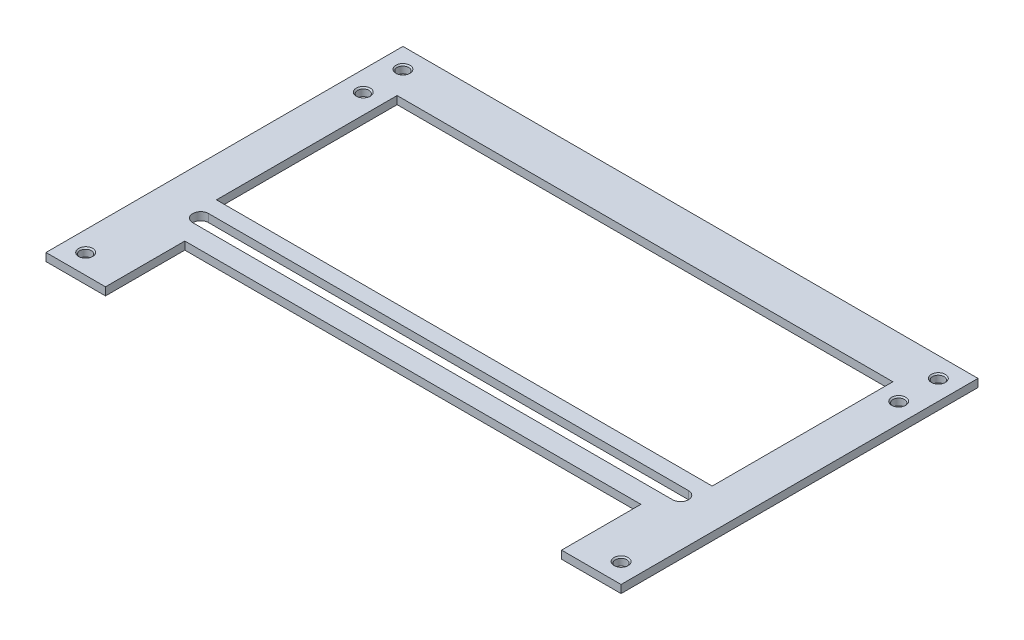
ISO-10303-21;
HEADER;
FILE_DESCRIPTION(('STEP AP214'),'2;1');
FILE_NAME('part.step','',(''),(''),'','','');
FILE_SCHEMA(('AUTOMOTIVE_DESIGN { 1 0 10303 214 1 1 1 1 }'));
ENDSEC;
DATA;
#1=APPLICATION_CONTEXT('core data for automotive mechanical design processes');
#2=APPLICATION_PROTOCOL_DEFINITION('international standard','automotive_design',2000,#1);
#3=PRODUCT_CONTEXT('',#1,'mechanical');
#4=PRODUCT('Part','Part','',(#3));
#5=PRODUCT_RELATED_PRODUCT_CATEGORY('part','',(#4));
#6=PRODUCT_DEFINITION_FORMATION('','',#4);
#7=PRODUCT_DEFINITION_CONTEXT('part definition',#1,'design');
#8=PRODUCT_DEFINITION('design','',#6,#7);
#9=PRODUCT_DEFINITION_SHAPE('','',#8);
#10=(LENGTH_UNIT() NAMED_UNIT(*) SI_UNIT(.MILLI.,.METRE.));
#11=(NAMED_UNIT(*) PLANE_ANGLE_UNIT() SI_UNIT($,.RADIAN.));
#12=(NAMED_UNIT(*) SI_UNIT($,.STERADIAN.) SOLID_ANGLE_UNIT());
#13=UNCERTAINTY_MEASURE_WITH_UNIT(LENGTH_MEASURE(1.E-05),#10,'distance_accuracy_value','');
#14=(GEOMETRIC_REPRESENTATION_CONTEXT(3) GLOBAL_UNCERTAINTY_ASSIGNED_CONTEXT((#13)) GLOBAL_UNIT_ASSIGNED_CONTEXT((#10,
#11,#12)) REPRESENTATION_CONTEXT('',''));
#15=CARTESIAN_POINT('',(0.,0.,0.));
#16=DIRECTION('',(0.,0.,1.));
#17=DIRECTION('',(1.,0.,0.));
#18=AXIS2_PLACEMENT_3D('',#15,#16,#17);
#19=CARTESIAN_POINT('',(0.,2.,0.));
#20=DIRECTION('',(1.,0.,0.));
#21=DIRECTION('',(0.,0.,-1.));
#22=AXIS2_PLACEMENT_3D('',#19,#20,#21);
#23=PLANE('',#22);
#24=DIRECTION('',(0.,0.,1.));
#25=VECTOR('',#24,1.);
#26=CARTESIAN_POINT('',(0.,0.,0.));
#27=LINE('',#26,#25);
#28=CARTESIAN_POINT('',(0.,0.,-80.));
#29=VERTEX_POINT('',#28);
#30=CARTESIAN_POINT('',(0.,0.,10.));
#31=VERTEX_POINT('',#30);
#32=EDGE_CURVE('E254',#29,#31,#27,.T.);
#33=ORIENTED_EDGE('',*,*,#32,.T.);
#34=DIRECTION('',(0.,-1.,0.));
#35=VECTOR('',#34,1.);
#36=CARTESIAN_POINT('',(0.,2.,10.));
#37=LINE('',#36,#35);
#38=CARTESIAN_POINT('',(0.,2.,10.));
#39=VERTEX_POINT('',#38);
#40=EDGE_CURVE('E311',#39,#31,#37,.T.);
#41=ORIENTED_EDGE('',*,*,#40,.F.);
#42=DIRECTION('',(0.,0.,1.));
#43=VECTOR('',#42,1.);
#44=CARTESIAN_POINT('',(0.,2.,0.));
#45=LINE('',#44,#43);
#46=CARTESIAN_POINT('',(0.,2.,-80.));
#47=VERTEX_POINT('',#46);
#48=EDGE_CURVE('E255',#47,#39,#45,.T.);
#49=ORIENTED_EDGE('',*,*,#48,.F.);
#50=DIRECTION('',(0.,-1.,0.));
#51=VECTOR('',#50,1.);
#52=CARTESIAN_POINT('',(0.,2.,-80.));
#53=LINE('',#52,#51);
#54=EDGE_CURVE('E272',#47,#29,#53,.T.);
#55=ORIENTED_EDGE('',*,*,#54,.T.);
#56=EDGE_LOOP('',(#33,#41,#49,#55));
#57=FACE_BOUND('',#56,.T.);
#58=ADVANCED_FACE('F41',(#57),#23,.F.);
#59=CARTESIAN_POINT('',(0.,2.,10.));
#60=DIRECTION('',(0.,0.,-1.));
#61=DIRECTION('',(-1.,0.,0.));
#62=AXIS2_PLACEMENT_3D('',#59,#60,#61);
#63=PLANE('',#62);
#64=DIRECTION('',(1.,0.,0.));
#65=VECTOR('',#64,1.);
#66=CARTESIAN_POINT('',(0.,0.,10.));
#67=LINE('',#66,#65);
#68=CARTESIAN_POINT('',(15.,0.,10.));
#69=VERTEX_POINT('',#68);
#70=EDGE_CURVE('E274',#31,#69,#67,.T.);
#71=ORIENTED_EDGE('',*,*,#70,.T.);
#72=DIRECTION('',(0.,-1.,0.));
#73=VECTOR('',#72,1.);
#74=CARTESIAN_POINT('',(15.,2.,10.));
#75=LINE('',#74,#73);
#76=CARTESIAN_POINT('',(15.,2.,10.));
#77=VERTEX_POINT('',#76);
#78=EDGE_CURVE('E308',#77,#69,#75,.T.);
#79=ORIENTED_EDGE('',*,*,#78,.F.);
#80=DIRECTION('',(1.,0.,0.));
#81=VECTOR('',#80,1.);
#82=CARTESIAN_POINT('',(0.,2.,10.));
#83=LINE('',#82,#81);
#84=EDGE_CURVE('E257',#39,#77,#83,.T.);
#85=ORIENTED_EDGE('',*,*,#84,.F.);
#86=ORIENTED_EDGE('',*,*,#40,.T.);
#87=EDGE_LOOP('',(#71,#79,#85,#86));
#88=FACE_BOUND('',#87,.T.);
#89=ADVANCED_FACE('F348',(#88),#63,.F.);
#90=CARTESIAN_POINT('',(15.,2.,0.));
#91=DIRECTION('',(-1.,0.,0.));
#92=DIRECTION('',(0.,0.,1.));
#93=AXIS2_PLACEMENT_3D('',#90,#91,#92);
#94=PLANE('',#93);
#95=DIRECTION('',(0.,0.,-1.));
#96=VECTOR('',#95,1.);
#97=CARTESIAN_POINT('',(15.,0.,0.));
#98=LINE('',#97,#96);
#99=CARTESIAN_POINT('',(15.,0.,-10.));
#100=VERTEX_POINT('',#99);
#101=EDGE_CURVE('E277',#69,#100,#98,.T.);
#102=ORIENTED_EDGE('',*,*,#101,.T.);
#103=DIRECTION('',(0.,-1.,0.));
#104=VECTOR('',#103,1.);
#105=CARTESIAN_POINT('',(15.,2.,-10.));
#106=LINE('',#105,#104);
#107=CARTESIAN_POINT('',(15.,2.,-10.));
#108=VERTEX_POINT('',#107);
#109=EDGE_CURVE('E305',#108,#100,#106,.T.);
#110=ORIENTED_EDGE('',*,*,#109,.F.);
#111=DIRECTION('',(0.,0.,-1.));
#112=VECTOR('',#111,1.);
#113=CARTESIAN_POINT('',(15.,2.,10.));
#114=LINE('',#113,#112);
#115=EDGE_CURVE('E260',#77,#108,#114,.T.);
#116=ORIENTED_EDGE('',*,*,#115,.F.);
#117=ORIENTED_EDGE('',*,*,#78,.T.);
#118=EDGE_LOOP('',(#102,#110,#116,#117));
#119=FACE_BOUND('',#118,.T.);
#120=ADVANCED_FACE('F353',(#119),#94,.F.);
#121=CARTESIAN_POINT('',(15.,2.,-10.));
#122=DIRECTION('',(0.,0.,-1.));
#123=DIRECTION('',(-1.,0.,0.));
#124=AXIS2_PLACEMENT_3D('',#121,#122,#123);
#125=PLANE('',#124);
#126=DIRECTION('',(1.,0.,0.));
#127=VECTOR('',#126,1.);
#128=CARTESIAN_POINT('',(15.,0.,-10.));
#129=LINE('',#128,#127);
#130=CARTESIAN_POINT('',(130.,0.,-10.));
#131=VERTEX_POINT('',#130);
#132=EDGE_CURVE('E279',#100,#131,#129,.T.);
#133=ORIENTED_EDGE('',*,*,#132,.T.);
#134=DIRECTION('',(0.,-1.,0.));
#135=VECTOR('',#134,1.);
#136=CARTESIAN_POINT('',(130.,2.,-10.));
#137=LINE('',#136,#135);
#138=CARTESIAN_POINT('',(130.,2.,-10.));
#139=VERTEX_POINT('',#138);
#140=EDGE_CURVE('E302',#139,#131,#137,.T.);
#141=ORIENTED_EDGE('',*,*,#140,.F.);
#142=DIRECTION('',(1.,0.,0.));
#143=VECTOR('',#142,1.);
#144=CARTESIAN_POINT('',(15.,2.,-10.));
#145=LINE('',#144,#143);
#146=EDGE_CURVE('E262',#108,#139,#145,.T.);
#147=ORIENTED_EDGE('',*,*,#146,.F.);
#148=ORIENTED_EDGE('',*,*,#109,.T.);
#149=EDGE_LOOP('',(#133,#141,#147,#148));
#150=FACE_BOUND('',#149,.T.);
#151=ADVANCED_FACE('F369',(#150),#125,.F.);
#152=CARTESIAN_POINT('',(130.,2.,10.));
#153=DIRECTION('',(1.,0.,0.));
#154=DIRECTION('',(0.,0.,-1.));
#155=AXIS2_PLACEMENT_3D('',#152,#153,#154);
#156=PLANE('',#155);
#157=DIRECTION('',(0.,0.,1.));
#158=VECTOR('',#157,1.);
#159=CARTESIAN_POINT('',(130.,0.,10.));
#160=LINE('',#159,#158);
#161=CARTESIAN_POINT('',(130.,0.,10.));
#162=VERTEX_POINT('',#161);
#163=EDGE_CURVE('E282',#131,#162,#160,.T.);
#164=ORIENTED_EDGE('',*,*,#163,.T.);
#165=DIRECTION('',(0.,-1.,0.));
#166=VECTOR('',#165,1.);
#167=CARTESIAN_POINT('',(130.,2.,10.));
#168=LINE('',#167,#166);
#169=CARTESIAN_POINT('',(130.,2.,10.));
#170=VERTEX_POINT('',#169);
#171=EDGE_CURVE('E299',#170,#162,#168,.T.);
#172=ORIENTED_EDGE('',*,*,#171,.F.);
#173=DIRECTION('',(0.,0.,1.));
#174=VECTOR('',#173,1.);
#175=CARTESIAN_POINT('',(130.,2.,-10.));
#176=LINE('',#175,#174);
#177=EDGE_CURVE('E264',#139,#170,#176,.T.);
#178=ORIENTED_EDGE('',*,*,#177,.F.);
#179=ORIENTED_EDGE('',*,*,#140,.T.);
#180=EDGE_LOOP('',(#164,#172,#178,#179));
#181=FACE_BOUND('',#180,.T.);
#182=ADVANCED_FACE('F393',(#181),#156,.F.);
#183=CARTESIAN_POINT('',(145.,2.,10.));
#184=DIRECTION('',(0.,0.,-1.));
#185=DIRECTION('',(-1.,0.,0.));
#186=AXIS2_PLACEMENT_3D('',#183,#184,#185);
#187=PLANE('',#186);
#188=DIRECTION('',(1.,0.,0.));
#189=VECTOR('',#188,1.);
#190=CARTESIAN_POINT('',(145.,0.,10.));
#191=LINE('',#190,#189);
#192=CARTESIAN_POINT('',(145.,0.,10.));
#193=VERTEX_POINT('',#192);
#194=EDGE_CURVE('E284',#162,#193,#191,.T.);
#195=ORIENTED_EDGE('',*,*,#194,.T.);
#196=DIRECTION('',(0.,-1.,0.));
#197=VECTOR('',#196,1.);
#198=CARTESIAN_POINT('',(145.,2.,10.));
#199=LINE('',#198,#197);
#200=CARTESIAN_POINT('',(145.,2.,10.));
#201=VERTEX_POINT('',#200);
#202=EDGE_CURVE('E296',#201,#193,#199,.T.);
#203=ORIENTED_EDGE('',*,*,#202,.F.);
#204=DIRECTION('',(1.,0.,0.));
#205=VECTOR('',#204,1.);
#206=CARTESIAN_POINT('',(145.,2.,10.));
#207=LINE('',#206,#205);
#208=EDGE_CURVE('E266',#170,#201,#207,.T.);
#209=ORIENTED_EDGE('',*,*,#208,.F.);
#210=ORIENTED_EDGE('',*,*,#171,.T.);
#211=EDGE_LOOP('',(#195,#203,#209,#210));
#212=FACE_BOUND('',#211,.T.);
#213=ADVANCED_FACE('F383',(#212),#187,.F.);
#214=CARTESIAN_POINT('',(145.,2.,0.));
#215=DIRECTION('',(-1.,0.,0.));
#216=DIRECTION('',(0.,0.,1.));
#217=AXIS2_PLACEMENT_3D('',#214,#215,#216);
#218=PLANE('',#217);
#219=DIRECTION('',(0.,0.,-1.));
#220=VECTOR('',#219,1.);
#221=CARTESIAN_POINT('',(145.,0.,0.));
#222=LINE('',#221,#220);
#223=CARTESIAN_POINT('',(145.,0.,-80.));
#224=VERTEX_POINT('',#223);
#225=EDGE_CURVE('E287',#193,#224,#222,.T.);
#226=ORIENTED_EDGE('',*,*,#225,.T.);
#227=DIRECTION('',(0.,-1.,0.));
#228=VECTOR('',#227,1.);
#229=CARTESIAN_POINT('',(145.,2.,-80.));
#230=LINE('',#229,#228);
#231=CARTESIAN_POINT('',(145.,2.,-80.));
#232=VERTEX_POINT('',#231);
#233=EDGE_CURVE('E293',#232,#224,#230,.T.);
#234=ORIENTED_EDGE('',*,*,#233,.F.);
#235=DIRECTION('',(0.,0.,-1.));
#236=VECTOR('',#235,1.);
#237=CARTESIAN_POINT('',(145.,2.,0.));
#238=LINE('',#237,#236);
#239=EDGE_CURVE('E268',#201,#232,#238,.T.);
#240=ORIENTED_EDGE('',*,*,#239,.F.);
#241=ORIENTED_EDGE('',*,*,#202,.T.);
#242=EDGE_LOOP('',(#226,#234,#240,#241));
#243=FACE_BOUND('',#242,.T.);
#244=ADVANCED_FACE('F385',(#243),#218,.F.);
#245=CARTESIAN_POINT('',(0.,2.,-80.));
#246=DIRECTION('',(0.,0.,1.));
#247=DIRECTION('',(1.,0.,0.));
#248=AXIS2_PLACEMENT_3D('',#245,#246,#247);
#249=PLANE('',#248);
#250=DIRECTION('',(-1.,0.,0.));
#251=VECTOR('',#250,1.);
#252=CARTESIAN_POINT('',(0.,0.,-80.));
#253=LINE('',#252,#251);
#254=EDGE_CURVE('E258',#224,#29,#253,.T.);
#255=ORIENTED_EDGE('',*,*,#254,.T.);
#256=ORIENTED_EDGE('',*,*,#54,.F.);
#257=DIRECTION('',(-1.,0.,0.));
#258=VECTOR('',#257,1.);
#259=CARTESIAN_POINT('',(0.,2.,-80.));
#260=LINE('',#259,#258);
#261=EDGE_CURVE('E270',#232,#47,#260,.T.);
#262=ORIENTED_EDGE('',*,*,#261,.F.);
#263=ORIENTED_EDGE('',*,*,#233,.T.);
#264=EDGE_LOOP('',(#255,#256,#262,#263));
#265=FACE_BOUND('',#264,.T.);
#266=ADVANCED_FACE('F378',(#265),#249,.F.);
#267=CARTESIAN_POINT('',(0.,2.,0.));
#268=DIRECTION('',(0.,-1.,0.));
#269=DIRECTION('',(0.,0.,-1.));
#270=AXIS2_PLACEMENT_3D('',#267,#268,#269);
#271=PLANE('',#270);
#272=DIRECTION('',(0.,0.,1.));
#273=VECTOR('',#272,1.);
#274=CARTESIAN_POINT('',(10.,2.,-22.9779952456449));
#275=LINE('',#274,#273);
#276=CARTESIAN_POINT('',(10.,2.,-68.5298389544826));
#277=VERTEX_POINT('',#276);
#278=CARTESIAN_POINT('',(10.,2.,-22.9779952456449));
#279=VERTEX_POINT('',#278);
#280=EDGE_CURVE('E164',#277,#279,#275,.T.);
#281=ORIENTED_EDGE('',*,*,#280,.F.);
#282=DIRECTION('',(-1.,0.,0.));
#283=VECTOR('',#282,1.);
#284=CARTESIAN_POINT('',(135.,2.,-68.5298389544826));
#285=LINE('',#284,#283);
#286=CARTESIAN_POINT('',(135.,2.,-68.5298389544826));
#287=VERTEX_POINT('',#286);
#288=EDGE_CURVE('E55',#287,#277,#285,.T.);
#289=ORIENTED_EDGE('',*,*,#288,.F.);
#290=DIRECTION('',(0.,0.,-1.));
#291=VECTOR('',#290,1.);
#292=CARTESIAN_POINT('',(135.,2.,-22.9779952456449));
#293=LINE('',#292,#291);
#294=CARTESIAN_POINT('',(135.,2.,-22.9779952456449));
#295=VERTEX_POINT('',#294);
#296=EDGE_CURVE('E171',#295,#287,#293,.T.);
#297=ORIENTED_EDGE('',*,*,#296,.F.);
#298=DIRECTION('',(1.,0.,0.));
#299=VECTOR('',#298,1.);
#300=CARTESIAN_POINT('',(10.,2.,-22.9779952456449));
#301=LINE('',#300,#299);
#302=EDGE_CURVE('E155',#279,#295,#301,.T.);
#303=ORIENTED_EDGE('',*,*,#302,.F.);
#304=EDGE_LOOP('',(#281,#289,#297,#303));
#305=FACE_BOUND('',#304,.T.);
#306=DIRECTION('',(1.,0.,0.));
#307=VECTOR('',#306,1.);
#308=CARTESIAN_POINT('',(12.,2.,-15.));
#309=LINE('',#308,#307);
#310=CARTESIAN_POINT('',(12.,2.,-15.));
#311=VERTEX_POINT('',#310);
#312=CARTESIAN_POINT('',(133.,2.,-15.));
#313=VERTEX_POINT('',#312);
#314=EDGE_CURVE('E182',#311,#313,#309,.T.);
#315=ORIENTED_EDGE('',*,*,#314,.F.);
#316=CARTESIAN_POINT('',(12.,2.,-17.));
#317=DIRECTION('',(0.,1.,0.));
#318=DIRECTION('',(0.,0.,1.));
#319=AXIS2_PLACEMENT_3D('',#316,#317,#318);
#320=CIRCLE('',#319,2.);
#321=CARTESIAN_POINT('',(12.,2.,-19.));
#322=VERTEX_POINT('',#321);
#323=EDGE_CURVE('E178',#322,#311,#320,.T.);
#324=ORIENTED_EDGE('',*,*,#323,.F.);
#325=DIRECTION('',(-1.,0.,0.));
#326=VECTOR('',#325,1.);
#327=CARTESIAN_POINT('',(12.,2.,-19.));
#328=LINE('',#327,#326);
#329=CARTESIAN_POINT('',(133.,2.,-19.));
#330=VERTEX_POINT('',#329);
#331=EDGE_CURVE('E188',#330,#322,#328,.T.);
#332=ORIENTED_EDGE('',*,*,#331,.F.);
#333=CARTESIAN_POINT('',(133.,2.,-17.));
#334=DIRECTION('',(0.,1.,0.));
#335=DIRECTION('',(0.,0.,1.));
#336=AXIS2_PLACEMENT_3D('',#333,#334,#335);
#337=CIRCLE('',#336,1.99999999999999);
#338=EDGE_CURVE('E185',#313,#330,#337,.T.);
#339=ORIENTED_EDGE('',*,*,#338,.F.);
#340=EDGE_LOOP('',(#315,#324,#332,#339));
#341=FACE_BOUND('',#340,.T.);
#342=CARTESIAN_POINT('',(140.,2.,-75.));
#343=DIRECTION('',(0.,1.,0.));
#344=DIRECTION('',(0.,0.,1.));
#345=AXIS2_PLACEMENT_3D('',#342,#343,#344);
#346=CIRCLE('',#345,1.775);
#347=CARTESIAN_POINT('',(140.,2.,-73.225));
#348=VERTEX_POINT('',#347);
#349=EDGE_CURVE('E194',#348,#348,#346,.T.);
#350=ORIENTED_EDGE('',*,*,#349,.F.);
#351=EDGE_LOOP('',(#350));
#352=FACE_BOUND('',#351,.T.);
#353=CARTESIAN_POINT('',(140.,2.,5.));
#354=DIRECTION('',(0.,1.,0.));
#355=DIRECTION('',(0.,0.,1.));
#356=AXIS2_PLACEMENT_3D('',#353,#354,#355);
#357=CIRCLE('',#356,1.775);
#358=CARTESIAN_POINT('',(140.,2.,6.775));
#359=VERTEX_POINT('',#358);
#360=EDGE_CURVE('E209',#359,#359,#357,.T.);
#361=ORIENTED_EDGE('',*,*,#360,.F.);
#362=EDGE_LOOP('',(#361));
#363=FACE_BOUND('',#362,.T.);
#364=CARTESIAN_POINT('',(5.,2.,4.99999999999999));
#365=DIRECTION('',(0.,1.,0.));
#366=DIRECTION('',(0.,0.,1.));
#367=AXIS2_PLACEMENT_3D('',#364,#365,#366);
#368=CIRCLE('',#367,1.775);
#369=CARTESIAN_POINT('',(5.,2.,6.77499999999999));
#370=VERTEX_POINT('',#369);
#371=EDGE_CURVE('E218',#370,#370,#368,.T.);
#372=ORIENTED_EDGE('',*,*,#371,.F.);
#373=EDGE_LOOP('',(#372));
#374=FACE_BOUND('',#373,.T.);
#375=CARTESIAN_POINT('',(5.,2.,-75.));
#376=DIRECTION('',(0.,1.,0.));
#377=DIRECTION('',(0.,0.,1.));
#378=AXIS2_PLACEMENT_3D('',#375,#376,#377);
#379=CIRCLE('',#378,1.775);
#380=CARTESIAN_POINT('',(5.,2.,-73.225));
#381=VERTEX_POINT('',#380);
#382=EDGE_CURVE('E227',#381,#381,#379,.T.);
#383=ORIENTED_EDGE('',*,*,#382,.F.);
#384=EDGE_LOOP('',(#383));
#385=FACE_BOUND('',#384,.T.);
#386=CARTESIAN_POINT('',(140.,2.,-65.));
#387=DIRECTION('',(0.,1.,0.));
#388=DIRECTION('',(0.,0.,1.));
#389=AXIS2_PLACEMENT_3D('',#386,#387,#388);
#390=CIRCLE('',#389,1.775);
#391=CARTESIAN_POINT('',(140.,2.,-63.225));
#392=VERTEX_POINT('',#391);
#393=EDGE_CURVE('E236',#392,#392,#390,.T.);
#394=ORIENTED_EDGE('',*,*,#393,.F.);
#395=EDGE_LOOP('',(#394));
#396=FACE_BOUND('',#395,.T.);
#397=CARTESIAN_POINT('',(5.00000000000001,2.,-65.));
#398=DIRECTION('',(0.,1.,0.));
#399=DIRECTION('',(0.,0.,1.));
#400=AXIS2_PLACEMENT_3D('',#397,#398,#399);
#401=CIRCLE('',#400,1.775);
#402=CARTESIAN_POINT('',(5.00000000000001,2.,-63.225));
#403=VERTEX_POINT('',#402);
#404=EDGE_CURVE('E245',#403,#403,#401,.T.);
#405=ORIENTED_EDGE('',*,*,#404,.F.);
#406=EDGE_LOOP('',(#405));
#407=FACE_BOUND('',#406,.T.);
#408=ORIENTED_EDGE('',*,*,#48,.T.);
#409=ORIENTED_EDGE('',*,*,#84,.T.);
#410=ORIENTED_EDGE('',*,*,#115,.T.);
#411=ORIENTED_EDGE('',*,*,#146,.T.);
#412=ORIENTED_EDGE('',*,*,#177,.T.);
#413=ORIENTED_EDGE('',*,*,#208,.T.);
#414=ORIENTED_EDGE('',*,*,#239,.T.);
#415=ORIENTED_EDGE('',*,*,#261,.T.);
#416=EDGE_LOOP('',(#408,#409,#410,#411,#412,#413,#414,#415));
#417=FACE_BOUND('',#416,.T.);
#418=ADVANCED_FACE('F168',(#305,#341,#352,#363,#374,#385,#396,#407,#417),#271,.F.);
#419=CARTESIAN_POINT('',(0.,0.,0.));
#420=DIRECTION('',(0.,-1.,0.));
#421=DIRECTION('',(0.,0.,-1.));
#422=AXIS2_PLACEMENT_3D('',#419,#420,#421);
#423=PLANE('',#422);
#424=DIRECTION('',(1.,0.,0.));
#425=VECTOR('',#424,1.);
#426=CARTESIAN_POINT('',(0.,0.,-68.5298389544826));
#427=LINE('',#426,#425);
#428=CARTESIAN_POINT('',(10.,0.,-68.5298389544826));
#429=VERTEX_POINT('',#428);
#430=CARTESIAN_POINT('',(135.,0.,-68.5298389544826));
#431=VERTEX_POINT('',#430);
#432=EDGE_CURVE('E11',#429,#431,#427,.T.);
#433=ORIENTED_EDGE('',*,*,#432,.F.);
#434=DIRECTION('',(0.,0.,-1.));
#435=VECTOR('',#434,1.);
#436=CARTESIAN_POINT('',(10.,0.,0.));
#437=LINE('',#436,#435);
#438=CARTESIAN_POINT('',(10.,0.,-22.9779952456449));
#439=VERTEX_POINT('',#438);
#440=EDGE_CURVE('E323',#439,#429,#437,.T.);
#441=ORIENTED_EDGE('',*,*,#440,.F.);
#442=DIRECTION('',(-1.,0.,0.));
#443=VECTOR('',#442,1.);
#444=CARTESIAN_POINT('',(0.,0.,-22.9779952456449));
#445=LINE('',#444,#443);
#446=CARTESIAN_POINT('',(135.,0.,-22.9779952456449));
#447=VERTEX_POINT('',#446);
#448=EDGE_CURVE('E158',#447,#439,#445,.T.);
#449=ORIENTED_EDGE('',*,*,#448,.F.);
#450=DIRECTION('',(0.,0.,1.));
#451=VECTOR('',#450,1.);
#452=CARTESIAN_POINT('',(135.,0.,0.));
#453=LINE('',#452,#451);
#454=EDGE_CURVE('E48',#431,#447,#453,.T.);
#455=ORIENTED_EDGE('',*,*,#454,.F.);
#456=EDGE_LOOP('',(#433,#441,#449,#455));
#457=FACE_BOUND('',#456,.T.);
#458=CARTESIAN_POINT('',(12.,0.,-17.));
#459=DIRECTION('',(0.,-1.,0.));
#460=DIRECTION('',(0.,0.,-1.));
#461=AXIS2_PLACEMENT_3D('',#458,#459,#460);
#462=CIRCLE('',#461,2.);
#463=CARTESIAN_POINT('',(12.,0.,-15.));
#464=VERTEX_POINT('',#463);
#465=CARTESIAN_POINT('',(12.,0.,-19.));
#466=VERTEX_POINT('',#465);
#467=EDGE_CURVE('E321',#464,#466,#462,.T.);
#468=ORIENTED_EDGE('',*,*,#467,.F.);
#469=DIRECTION('',(-1.,0.,0.));
#470=VECTOR('',#469,1.);
#471=CARTESIAN_POINT('',(0.,0.,-15.));
#472=LINE('',#471,#470);
#473=CARTESIAN_POINT('',(133.,0.,-15.));
#474=VERTEX_POINT('',#473);
#475=EDGE_CURVE('E314',#474,#464,#472,.T.);
#476=ORIENTED_EDGE('',*,*,#475,.F.);
#477=CARTESIAN_POINT('',(133.,0.,-17.));
#478=DIRECTION('',(0.,-1.,0.));
#479=DIRECTION('',(0.,0.,-1.));
#480=AXIS2_PLACEMENT_3D('',#477,#478,#479);
#481=CIRCLE('',#480,1.99999999999999);
#482=CARTESIAN_POINT('',(133.,0.,-19.));
#483=VERTEX_POINT('',#482);
#484=EDGE_CURVE('E316',#483,#474,#481,.T.);
#485=ORIENTED_EDGE('',*,*,#484,.F.);
#486=DIRECTION('',(1.,0.,0.));
#487=VECTOR('',#486,1.);
#488=CARTESIAN_POINT('',(0.,0.,-19.));
#489=LINE('',#488,#487);
#490=EDGE_CURVE('E319',#466,#483,#489,.T.);
#491=ORIENTED_EDGE('',*,*,#490,.F.);
#492=EDGE_LOOP('',(#468,#476,#485,#491));
#493=FACE_BOUND('',#492,.T.);
#494=CARTESIAN_POINT('',(140.,0.,-75.));
#495=DIRECTION('',(0.,1.,0.));
#496=DIRECTION('',(0.,0.,1.));
#497=AXIS2_PLACEMENT_3D('',#494,#495,#496);
#498=CIRCLE('',#497,1.45000000000001);
#499=CARTESIAN_POINT('',(140.,0.,-73.55));
#500=VERTEX_POINT('',#499);
#501=EDGE_CURVE('E206',#500,#500,#498,.T.);
#502=ORIENTED_EDGE('',*,*,#501,.T.);
#503=EDGE_LOOP('',(#502));
#504=FACE_BOUND('',#503,.T.);
#505=CARTESIAN_POINT('',(140.,0.,5.));
#506=DIRECTION('',(0.,1.,0.));
#507=DIRECTION('',(0.,0.,1.));
#508=AXIS2_PLACEMENT_3D('',#505,#506,#507);
#509=CIRCLE('',#508,1.45000000000001);
#510=CARTESIAN_POINT('',(140.,0.,6.45000000000001));
#511=VERTEX_POINT('',#510);
#512=EDGE_CURVE('E215',#511,#511,#509,.T.);
#513=ORIENTED_EDGE('',*,*,#512,.T.);
#514=EDGE_LOOP('',(#513));
#515=FACE_BOUND('',#514,.T.);
#516=CARTESIAN_POINT('',(5.,0.,4.99999999999999));
#517=DIRECTION('',(0.,1.,0.));
#518=DIRECTION('',(0.,0.,1.));
#519=AXIS2_PLACEMENT_3D('',#516,#517,#518);
#520=CIRCLE('',#519,1.45);
#521=CARTESIAN_POINT('',(5.,0.,6.44999999999999));
#522=VERTEX_POINT('',#521);
#523=EDGE_CURVE('E224',#522,#522,#520,.T.);
#524=ORIENTED_EDGE('',*,*,#523,.T.);
#525=EDGE_LOOP('',(#524));
#526=FACE_BOUND('',#525,.T.);
#527=CARTESIAN_POINT('',(5.,0.,-75.));
#528=DIRECTION('',(0.,1.,0.));
#529=DIRECTION('',(0.,0.,1.));
#530=AXIS2_PLACEMENT_3D('',#527,#528,#529);
#531=CIRCLE('',#530,1.45);
#532=CARTESIAN_POINT('',(5.,0.,-73.55));
#533=VERTEX_POINT('',#532);
#534=EDGE_CURVE('E233',#533,#533,#531,.T.);
#535=ORIENTED_EDGE('',*,*,#534,.T.);
#536=EDGE_LOOP('',(#535));
#537=FACE_BOUND('',#536,.T.);
#538=CARTESIAN_POINT('',(140.,0.,-65.));
#539=DIRECTION('',(0.,1.,0.));
#540=DIRECTION('',(0.,0.,1.));
#541=AXIS2_PLACEMENT_3D('',#538,#539,#540);
#542=CIRCLE('',#541,1.45000000000001);
#543=CARTESIAN_POINT('',(140.,0.,-63.55));
#544=VERTEX_POINT('',#543);
#545=EDGE_CURVE('E242',#544,#544,#542,.T.);
#546=ORIENTED_EDGE('',*,*,#545,.T.);
#547=EDGE_LOOP('',(#546));
#548=FACE_BOUND('',#547,.T.);
#549=CARTESIAN_POINT('',(5.00000000000001,0.,-65.));
#550=DIRECTION('',(0.,1.,0.));
#551=DIRECTION('',(0.,0.,1.));
#552=AXIS2_PLACEMENT_3D('',#549,#550,#551);
#553=CIRCLE('',#552,1.45);
#554=CARTESIAN_POINT('',(5.00000000000001,0.,-63.55));
#555=VERTEX_POINT('',#554);
#556=EDGE_CURVE('E251',#555,#555,#553,.T.);
#557=ORIENTED_EDGE('',*,*,#556,.T.);
#558=EDGE_LOOP('',(#557));
#559=FACE_BOUND('',#558,.T.);
#560=ORIENTED_EDGE('',*,*,#32,.F.);
#561=ORIENTED_EDGE('',*,*,#254,.F.);
#562=ORIENTED_EDGE('',*,*,#225,.F.);
#563=ORIENTED_EDGE('',*,*,#194,.F.);
#564=ORIENTED_EDGE('',*,*,#163,.F.);
#565=ORIENTED_EDGE('',*,*,#132,.F.);
#566=ORIENTED_EDGE('',*,*,#101,.F.);
#567=ORIENTED_EDGE('',*,*,#70,.F.);
#568=EDGE_LOOP('',(#560,#561,#562,#563,#564,#565,#566,#567));
#569=FACE_BOUND('',#568,.T.);
#570=ADVANCED_FACE('F331',(#457,#493,#504,#515,#526,#537,#548,#559,#569),#423,.T.);
#571=CARTESIAN_POINT('',(5.00000000000001,2.,-65.));
#572=DIRECTION('',(0.,1.,0.));
#573=DIRECTION('',(0.,0.,1.));
#574=AXIS2_PLACEMENT_3D('',#571,#572,#573);
#575=CYLINDRICAL_SURFACE('',#574,1.44999999999999);
#576=ORIENTED_EDGE('',*,*,#556,.F.);
#577=EDGE_LOOP('',(#576));
#578=FACE_BOUND('',#577,.T.);
#579=CARTESIAN_POINT('',(5.00000000000001,1.67499999999999,-65.));
#580=DIRECTION('',(0.,1.,0.));
#581=DIRECTION('',(0.,0.,1.));
#582=AXIS2_PLACEMENT_3D('',#579,#580,#581);
#583=CIRCLE('',#582,1.44999999999999);
#584=CARTESIAN_POINT('',(5.00000000000001,1.67499999999999,-63.55));
#585=VERTEX_POINT('',#584);
#586=EDGE_CURVE('E248',#585,#585,#583,.T.);
#587=ORIENTED_EDGE('',*,*,#586,.T.);
#588=EDGE_LOOP('',(#587));
#589=FACE_BOUND('',#588,.T.);
#590=ADVANCED_FACE('F439',(#578,#589),#575,.F.);
#591=CARTESIAN_POINT('',(5.00000000000001,2.,-65.));
#592=DIRECTION('',(0.,1.,0.));
#593=DIRECTION('',(0.,0.,1.));
#594=AXIS2_PLACEMENT_3D('',#591,#592,#593);
#595=CONICAL_SURFACE('',#594,1.775,0.785398163397456);
#596=ORIENTED_EDGE('',*,*,#586,.F.);
#597=EDGE_LOOP('',(#596));
#598=FACE_BOUND('',#597,.T.);
#599=ORIENTED_EDGE('',*,*,#404,.T.);
#600=EDGE_LOOP('',(#599));
#601=FACE_BOUND('',#600,.T.);
#602=ADVANCED_FACE('F445',(#598,#601),#595,.F.);
#603=CARTESIAN_POINT('',(140.,2.,-65.));
#604=DIRECTION('',(0.,1.,0.));
#605=DIRECTION('',(0.,0.,1.));
#606=AXIS2_PLACEMENT_3D('',#603,#604,#605);
#607=CYLINDRICAL_SURFACE('',#606,1.44999999999999);
#608=ORIENTED_EDGE('',*,*,#545,.F.);
#609=EDGE_LOOP('',(#608));
#610=FACE_BOUND('',#609,.T.);
#611=CARTESIAN_POINT('',(140.,1.67499999999999,-65.));
#612=DIRECTION('',(0.,1.,0.));
#613=DIRECTION('',(0.,0.,1.));
#614=AXIS2_PLACEMENT_3D('',#611,#612,#613);
#615=CIRCLE('',#614,1.44999999999998);
#616=CARTESIAN_POINT('',(140.,1.67499999999999,-63.55));
#617=VERTEX_POINT('',#616);
#618=EDGE_CURVE('E239',#617,#617,#615,.T.);
#619=ORIENTED_EDGE('',*,*,#618,.T.);
#620=EDGE_LOOP('',(#619));
#621=FACE_BOUND('',#620,.T.);
#622=ADVANCED_FACE('F459',(#610,#621),#607,.F.);
#623=CARTESIAN_POINT('',(140.,2.,-65.));
#624=DIRECTION('',(0.,1.,0.));
#625=DIRECTION('',(0.,0.,1.));
#626=AXIS2_PLACEMENT_3D('',#623,#624,#625);
#627=CONICAL_SURFACE('',#626,1.775,0.785398163397467);
#628=ORIENTED_EDGE('',*,*,#618,.F.);
#629=EDGE_LOOP('',(#628));
#630=FACE_BOUND('',#629,.T.);
#631=ORIENTED_EDGE('',*,*,#393,.T.);
#632=EDGE_LOOP('',(#631));
#633=FACE_BOUND('',#632,.T.);
#634=ADVANCED_FACE('F470',(#630,#633),#627,.F.);
#635=CARTESIAN_POINT('',(5.,2.,-75.));
#636=DIRECTION('',(0.,1.,0.));
#637=DIRECTION('',(0.,0.,1.));
#638=AXIS2_PLACEMENT_3D('',#635,#636,#637);
#639=CYLINDRICAL_SURFACE('',#638,1.44999999999999);
#640=ORIENTED_EDGE('',*,*,#534,.F.);
#641=EDGE_LOOP('',(#640));
#642=FACE_BOUND('',#641,.T.);
#643=CARTESIAN_POINT('',(5.,1.67499999999999,-75.));
#644=DIRECTION('',(0.,1.,0.));
#645=DIRECTION('',(0.,0.,1.));
#646=AXIS2_PLACEMENT_3D('',#643,#644,#645);
#647=CIRCLE('',#646,1.44999999999999);
#648=CARTESIAN_POINT('',(5.,1.67499999999999,-73.55));
#649=VERTEX_POINT('',#648);
#650=EDGE_CURVE('E230',#649,#649,#647,.T.);
#651=ORIENTED_EDGE('',*,*,#650,.T.);
#652=EDGE_LOOP('',(#651));
#653=FACE_BOUND('',#652,.T.);
#654=ADVANCED_FACE('F481',(#642,#653),#639,.F.);
#655=CARTESIAN_POINT('',(5.,2.,-75.));
#656=DIRECTION('',(0.,1.,0.));
#657=DIRECTION('',(0.,0.,1.));
#658=AXIS2_PLACEMENT_3D('',#655,#656,#657);
#659=CONICAL_SURFACE('',#658,1.775,0.785398163397456);
#660=ORIENTED_EDGE('',*,*,#650,.F.);
#661=EDGE_LOOP('',(#660));
#662=FACE_BOUND('',#661,.T.);
#663=ORIENTED_EDGE('',*,*,#382,.T.);
#664=EDGE_LOOP('',(#663));
#665=FACE_BOUND('',#664,.T.);
#666=ADVANCED_FACE('F493',(#662,#665),#659,.F.);
#667=CARTESIAN_POINT('',(5.,2.,4.99999999999999));
#668=DIRECTION('',(0.,1.,0.));
#669=DIRECTION('',(0.,0.,1.));
#670=AXIS2_PLACEMENT_3D('',#667,#668,#669);
#671=CYLINDRICAL_SURFACE('',#670,1.44999999999999);
#672=ORIENTED_EDGE('',*,*,#523,.F.);
#673=EDGE_LOOP('',(#672));
#674=FACE_BOUND('',#673,.T.);
#675=CARTESIAN_POINT('',(5.,1.67499999999999,4.99999999999999));
#676=DIRECTION('',(0.,1.,0.));
#677=DIRECTION('',(0.,0.,1.));
#678=AXIS2_PLACEMENT_3D('',#675,#676,#677);
#679=CIRCLE('',#678,1.44999999999999);
#680=CARTESIAN_POINT('',(5.,1.67499999999999,6.44999999999998));
#681=VERTEX_POINT('',#680);
#682=EDGE_CURVE('E221',#681,#681,#679,.T.);
#683=ORIENTED_EDGE('',*,*,#682,.T.);
#684=EDGE_LOOP('',(#683));
#685=FACE_BOUND('',#684,.T.);
#686=ADVANCED_FACE('F505',(#674,#685),#671,.F.);
#687=CARTESIAN_POINT('',(5.,2.,4.99999999999999));
#688=DIRECTION('',(0.,1.,0.));
#689=DIRECTION('',(0.,0.,1.));
#690=AXIS2_PLACEMENT_3D('',#687,#688,#689);
#691=CONICAL_SURFACE('',#690,1.775,0.785398163397456);
#692=ORIENTED_EDGE('',*,*,#682,.F.);
#693=EDGE_LOOP('',(#692));
#694=FACE_BOUND('',#693,.T.);
#695=ORIENTED_EDGE('',*,*,#371,.T.);
#696=EDGE_LOOP('',(#695));
#697=FACE_BOUND('',#696,.T.);
#698=ADVANCED_FACE('F516',(#694,#697),#691,.F.);
#699=CARTESIAN_POINT('',(140.,2.,5.));
#700=DIRECTION('',(0.,1.,0.));
#701=DIRECTION('',(0.,0.,1.));
#702=AXIS2_PLACEMENT_3D('',#699,#700,#701);
#703=CYLINDRICAL_SURFACE('',#702,1.44999999999999);
#704=ORIENTED_EDGE('',*,*,#512,.F.);
#705=EDGE_LOOP('',(#704));
#706=FACE_BOUND('',#705,.T.);
#707=CARTESIAN_POINT('',(140.,1.67499999999999,5.));
#708=DIRECTION('',(0.,1.,0.));
#709=DIRECTION('',(0.,0.,1.));
#710=AXIS2_PLACEMENT_3D('',#707,#708,#709);
#711=CIRCLE('',#710,1.44999999999998);
#712=CARTESIAN_POINT('',(140.,1.67499999999999,6.44999999999998));
#713=VERTEX_POINT('',#712);
#714=EDGE_CURVE('E212',#713,#713,#711,.T.);
#715=ORIENTED_EDGE('',*,*,#714,.T.);
#716=EDGE_LOOP('',(#715));
#717=FACE_BOUND('',#716,.T.);
#718=ADVANCED_FACE('F528',(#706,#717),#703,.F.);
#719=CARTESIAN_POINT('',(140.,2.,5.));
#720=DIRECTION('',(0.,1.,0.));
#721=DIRECTION('',(0.,0.,1.));
#722=AXIS2_PLACEMENT_3D('',#719,#720,#721);
#723=CONICAL_SURFACE('',#722,1.775,0.785398163397467);
#724=ORIENTED_EDGE('',*,*,#714,.F.);
#725=EDGE_LOOP('',(#724));
#726=FACE_BOUND('',#725,.T.);
#727=ORIENTED_EDGE('',*,*,#360,.T.);
#728=EDGE_LOOP('',(#727));
#729=FACE_BOUND('',#728,.T.);
#730=ADVANCED_FACE('F539',(#726,#729),#723,.F.);
#731=CARTESIAN_POINT('',(140.,2.,-75.));
#732=DIRECTION('',(0.,1.,0.));
#733=DIRECTION('',(0.,0.,1.));
#734=AXIS2_PLACEMENT_3D('',#731,#732,#733);
#735=CYLINDRICAL_SURFACE('',#734,1.44999999999999);
#736=ORIENTED_EDGE('',*,*,#501,.F.);
#737=EDGE_LOOP('',(#736));
#738=FACE_BOUND('',#737,.T.);
#739=CARTESIAN_POINT('',(140.,1.67499999999999,-75.));
#740=DIRECTION('',(0.,1.,0.));
#741=DIRECTION('',(0.,0.,1.));
#742=AXIS2_PLACEMENT_3D('',#739,#740,#741);
#743=CIRCLE('',#742,1.44999999999998);
#744=CARTESIAN_POINT('',(140.,1.67499999999999,-73.55));
#745=VERTEX_POINT('',#744);
#746=EDGE_CURVE('E203',#745,#745,#743,.T.);
#747=ORIENTED_EDGE('',*,*,#746,.T.);
#748=EDGE_LOOP('',(#747));
#749=FACE_BOUND('',#748,.T.);
#750=ADVANCED_FACE('F550',(#738,#749),#735,.F.);
#751=CARTESIAN_POINT('',(140.,2.,-75.));
#752=DIRECTION('',(0.,1.,0.));
#753=DIRECTION('',(0.,0.,1.));
#754=AXIS2_PLACEMENT_3D('',#751,#752,#753);
#755=CONICAL_SURFACE('',#754,1.775,0.785398163397467);
#756=ORIENTED_EDGE('',*,*,#746,.F.);
#757=EDGE_LOOP('',(#756));
#758=FACE_BOUND('',#757,.T.);
#759=ORIENTED_EDGE('',*,*,#349,.T.);
#760=EDGE_LOOP('',(#759));
#761=FACE_BOUND('',#760,.T.);
#762=ADVANCED_FACE('F561',(#758,#761),#755,.F.);
#763=CARTESIAN_POINT('',(12.,-1.,-17.));
#764=DIRECTION('',(0.,1.,0.));
#765=DIRECTION('',(0.,0.,1.));
#766=AXIS2_PLACEMENT_3D('',#763,#764,#765);
#767=CYLINDRICAL_SURFACE('',#766,2.);
#768=ORIENTED_EDGE('',*,*,#467,.T.);
#769=DIRECTION('',(0.,1.,0.));
#770=VECTOR('',#769,1.);
#771=CARTESIAN_POINT('',(12.,-1.,-19.));
#772=LINE('',#771,#770);
#773=EDGE_CURVE('E192',#466,#322,#772,.T.);
#774=ORIENTED_EDGE('',*,*,#773,.T.);
#775=ORIENTED_EDGE('',*,*,#323,.T.);
#776=DIRECTION('',(0.,1.,0.));
#777=VECTOR('',#776,1.);
#778=CARTESIAN_POINT('',(12.,-1.,-15.));
#779=LINE('',#778,#777);
#780=EDGE_CURVE('E191',#464,#311,#779,.T.);
#781=ORIENTED_EDGE('',*,*,#780,.F.);
#782=EDGE_LOOP('',(#768,#774,#775,#781));
#783=FACE_BOUND('',#782,.T.);
#784=ADVANCED_FACE('F572',(#783),#767,.F.);
#785=CARTESIAN_POINT('',(12.,-1.,-19.));
#786=DIRECTION('',(0.,0.,-1.));
#787=DIRECTION('',(-1.,0.,0.));
#788=AXIS2_PLACEMENT_3D('',#785,#786,#787);
#789=PLANE('',#788);
#790=ORIENTED_EDGE('',*,*,#490,.T.);
#791=DIRECTION('',(0.,1.,0.));
#792=VECTOR('',#791,1.);
#793=CARTESIAN_POINT('',(133.,-1.,-19.));
#794=LINE('',#793,#792);
#795=EDGE_CURVE('E195',#483,#330,#794,.T.);
#796=ORIENTED_EDGE('',*,*,#795,.T.);
#797=ORIENTED_EDGE('',*,*,#331,.T.);
#798=ORIENTED_EDGE('',*,*,#773,.F.);
#799=EDGE_LOOP('',(#790,#796,#797,#798));
#800=FACE_BOUND('',#799,.T.);
#801=ADVANCED_FACE('F583',(#800),#789,.F.);
#802=CARTESIAN_POINT('',(133.,-1.,-17.));
#803=DIRECTION('',(0.,1.,0.));
#804=DIRECTION('',(0.,0.,1.));
#805=AXIS2_PLACEMENT_3D('',#802,#803,#804);
#806=CYLINDRICAL_SURFACE('',#805,1.99999999999999);
#807=ORIENTED_EDGE('',*,*,#484,.T.);
#808=DIRECTION('',(0.,1.,0.));
#809=VECTOR('',#808,1.);
#810=CARTESIAN_POINT('',(133.,-1.,-15.));
#811=LINE('',#810,#809);
#812=EDGE_CURVE('E197',#474,#313,#811,.T.);
#813=ORIENTED_EDGE('',*,*,#812,.T.);
#814=ORIENTED_EDGE('',*,*,#338,.T.);
#815=ORIENTED_EDGE('',*,*,#795,.F.);
#816=EDGE_LOOP('',(#807,#813,#814,#815));
#817=FACE_BOUND('',#816,.T.);
#818=ADVANCED_FACE('F342',(#817),#806,.F.);
#819=CARTESIAN_POINT('',(12.,-1.,-15.));
#820=DIRECTION('',(0.,0.,1.));
#821=DIRECTION('',(1.,0.,0.));
#822=AXIS2_PLACEMENT_3D('',#819,#820,#821);
#823=PLANE('',#822);
#824=ORIENTED_EDGE('',*,*,#475,.T.);
#825=ORIENTED_EDGE('',*,*,#780,.T.);
#826=ORIENTED_EDGE('',*,*,#314,.T.);
#827=ORIENTED_EDGE('',*,*,#812,.F.);
#828=EDGE_LOOP('',(#824,#825,#826,#827));
#829=FACE_BOUND('',#828,.T.);
#830=ADVANCED_FACE('F335',(#829),#823,.F.);
#831=CARTESIAN_POINT('',(135.,-1.,-68.5298389544826));
#832=DIRECTION('',(0.,0.,-1.));
#833=DIRECTION('',(-1.,0.,0.));
#834=AXIS2_PLACEMENT_3D('',#831,#832,#833);
#835=PLANE('',#834);
#836=ORIENTED_EDGE('',*,*,#432,.T.);
#837=DIRECTION('',(0.,1.,0.));
#838=VECTOR('',#837,1.);
#839=CARTESIAN_POINT('',(135.,-1.,-68.5298389544826));
#840=LINE('',#839,#838);
#841=EDGE_CURVE('E176',#431,#287,#840,.T.);
#842=ORIENTED_EDGE('',*,*,#841,.T.);
#843=ORIENTED_EDGE('',*,*,#288,.T.);
#844=DIRECTION('',(0.,1.,0.));
#845=VECTOR('',#844,1.);
#846=CARTESIAN_POINT('',(10.,-1.,-68.5298389544826));
#847=LINE('',#846,#845);
#848=EDGE_CURVE('E161',#429,#277,#847,.T.);
#849=ORIENTED_EDGE('',*,*,#848,.F.);
#850=EDGE_LOOP('',(#836,#842,#843,#849));
#851=FACE_BOUND('',#850,.T.);
#852=ADVANCED_FACE('F333',(#851),#835,.F.);
#853=CARTESIAN_POINT('',(135.,-1.,-22.9779952456449));
#854=DIRECTION('',(1.,0.,0.));
#855=DIRECTION('',(0.,0.,-1.));
#856=AXIS2_PLACEMENT_3D('',#853,#854,#855);
#857=PLANE('',#856);
#858=ORIENTED_EDGE('',*,*,#454,.T.);
#859=DIRECTION('',(0.,1.,0.));
#860=VECTOR('',#859,1.);
#861=CARTESIAN_POINT('',(135.,-1.,-22.9779952456449));
#862=LINE('',#861,#860);
#863=EDGE_CURVE('E160',#447,#295,#862,.T.);
#864=ORIENTED_EDGE('',*,*,#863,.T.);
#865=ORIENTED_EDGE('',*,*,#296,.T.);
#866=ORIENTED_EDGE('',*,*,#841,.F.);
#867=EDGE_LOOP('',(#858,#864,#865,#866));
#868=FACE_BOUND('',#867,.T.);
#869=ADVANCED_FACE('F328',(#868),#857,.F.);
#870=CARTESIAN_POINT('',(10.,-1.,-22.9779952456449));
#871=DIRECTION('',(0.,0.,1.));
#872=DIRECTION('',(1.,0.,0.));
#873=AXIS2_PLACEMENT_3D('',#870,#871,#872);
#874=PLANE('',#873);
#875=ORIENTED_EDGE('',*,*,#448,.T.);
#876=DIRECTION('',(0.,1.,0.));
#877=VECTOR('',#876,1.);
#878=CARTESIAN_POINT('',(10.,-1.,-22.9779952456449));
#879=LINE('',#878,#877);
#880=EDGE_CURVE('E63',#439,#279,#879,.T.);
#881=ORIENTED_EDGE('',*,*,#880,.T.);
#882=ORIENTED_EDGE('',*,*,#302,.T.);
#883=ORIENTED_EDGE('',*,*,#863,.F.);
#884=EDGE_LOOP('',(#875,#881,#882,#883));
#885=FACE_BOUND('',#884,.T.);
#886=ADVANCED_FACE('F152',(#885),#874,.F.);
#887=CARTESIAN_POINT('',(10.,-1.,-22.9779952456449));
#888=DIRECTION('',(-1.,0.,0.));
#889=DIRECTION('',(0.,0.,1.));
#890=AXIS2_PLACEMENT_3D('',#887,#888,#889);
#891=PLANE('',#890);
#892=ORIENTED_EDGE('',*,*,#440,.T.);
#893=ORIENTED_EDGE('',*,*,#848,.T.);
#894=ORIENTED_EDGE('',*,*,#280,.T.);
#895=ORIENTED_EDGE('',*,*,#880,.F.);
#896=EDGE_LOOP('',(#892,#893,#894,#895));
#897=FACE_BOUND('',#896,.T.);
#898=ADVANCED_FACE('F165',(#897),#891,.F.);
#899=CLOSED_SHELL('',(#58,#89,#120,#151,#182,#213,#244,#266,#418,#570,#590,#602,#622,#634,#654,
#666,#686,#698,#718,#730,#750,#762,#784,#801,#818,#830,#852,#869,#886,#898));
#900=MANIFOLD_SOLID_BREP('B2',#899);
#901=ADVANCED_BREP_SHAPE_REPRESENTATION('',(#18,#900),#14);
#902=SHAPE_DEFINITION_REPRESENTATION(#9,#901);
ENDSEC;
END-ISO-10303-21;
